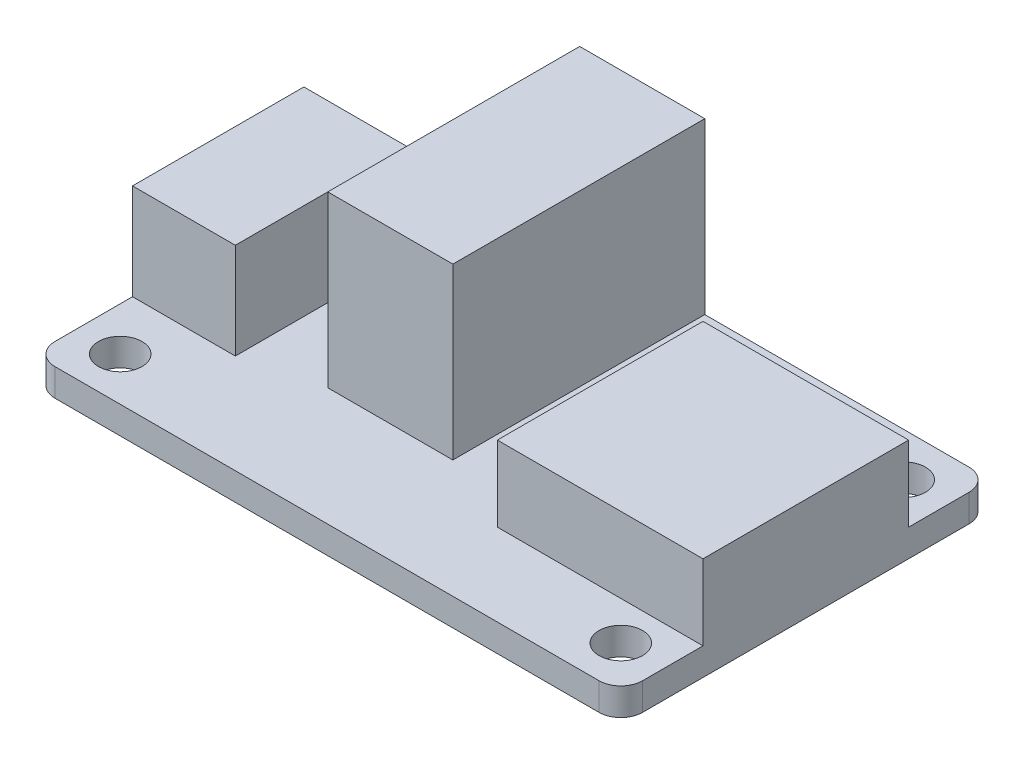
ISO-10303-21;
HEADER;
FILE_DESCRIPTION(('STEP AP214'),'2;1');
FILE_NAME('part.step','',(''),(''),'','','');
FILE_SCHEMA(('AUTOMOTIVE_DESIGN { 1 0 10303 214 1 1 1 1 }'));
ENDSEC;
DATA;
#1=APPLICATION_CONTEXT('core data for automotive mechanical design processes');
#2=APPLICATION_PROTOCOL_DEFINITION('international standard','automotive_design',2000,#1);
#3=PRODUCT_CONTEXT('',#1,'mechanical');
#4=PRODUCT('Part','Part','',(#3));
#5=PRODUCT_RELATED_PRODUCT_CATEGORY('part','',(#4));
#6=PRODUCT_DEFINITION_FORMATION('','',#4);
#7=PRODUCT_DEFINITION_CONTEXT('part definition',#1,'design');
#8=PRODUCT_DEFINITION('design','',#6,#7);
#9=PRODUCT_DEFINITION_SHAPE('','',#8);
#10=(LENGTH_UNIT() NAMED_UNIT(*) SI_UNIT(.MILLI.,.METRE.));
#11=(NAMED_UNIT(*) PLANE_ANGLE_UNIT() SI_UNIT($,.RADIAN.));
#12=(NAMED_UNIT(*) SI_UNIT($,.STERADIAN.) SOLID_ANGLE_UNIT());
#13=UNCERTAINTY_MEASURE_WITH_UNIT(LENGTH_MEASURE(1.E-05),#10,'distance_accuracy_value','');
#14=(GEOMETRIC_REPRESENTATION_CONTEXT(3) GLOBAL_UNCERTAINTY_ASSIGNED_CONTEXT((#13)) GLOBAL_UNIT_ASSIGNED_CONTEXT((#10,
#11,#12)) REPRESENTATION_CONTEXT('',''));
#15=CARTESIAN_POINT('',(0.,0.,0.));
#16=DIRECTION('',(0.,0.,1.));
#17=DIRECTION('',(1.,0.,0.));
#18=AXIS2_PLACEMENT_3D('',#15,#16,#17);
#19=CARTESIAN_POINT('',(0.,1.6,0.));
#20=DIRECTION('',(0.,-1.,0.));
#21=DIRECTION('',(0.,0.,-1.));
#22=AXIS2_PLACEMENT_3D('',#19,#20,#21);
#23=PLANE('',#22);
#24=CARTESIAN_POINT('',(-14.605,1.6,8.255));
#25=DIRECTION('',(0.,1.,0.));
#26=DIRECTION('',(0.,0.,-1.));
#27=AXIS2_PLACEMENT_3D('',#24,#25,#26);
#28=CIRCLE('',#27,1.27);
#29=CARTESIAN_POINT('',(-14.605,1.6,6.985));
#30=VERTEX_POINT('',#29);
#31=EDGE_CURVE('E256',#30,#30,#28,.T.);
#32=ORIENTED_EDGE('',*,*,#31,.F.);
#33=EDGE_LOOP('',(#32));
#34=FACE_BOUND('',#33,.T.);
#35=CARTESIAN_POINT('',(14.605,1.6,8.255));
#36=DIRECTION('',(0.,1.,0.));
#37=DIRECTION('',(0.,0.,1.));
#38=AXIS2_PLACEMENT_3D('',#35,#36,#37);
#39=CIRCLE('',#38,1.27);
#40=CARTESIAN_POINT('',(14.605,1.6,9.52500000000001));
#41=VERTEX_POINT('',#40);
#42=EDGE_CURVE('E262',#41,#41,#39,.T.);
#43=ORIENTED_EDGE('',*,*,#42,.F.);
#44=EDGE_LOOP('',(#43));
#45=FACE_BOUND('',#44,.T.);
#46=CARTESIAN_POINT('',(14.605,1.6,-8.255));
#47=DIRECTION('',(0.,1.,0.));
#48=DIRECTION('',(0.,0.,-1.));
#49=AXIS2_PLACEMENT_3D('',#46,#47,#48);
#50=CIRCLE('',#49,1.27);
#51=CARTESIAN_POINT('',(14.605,1.6,-9.52500000000001));
#52=VERTEX_POINT('',#51);
#53=EDGE_CURVE('E268',#52,#52,#50,.T.);
#54=ORIENTED_EDGE('',*,*,#53,.F.);
#55=EDGE_LOOP('',(#54));
#56=FACE_BOUND('',#55,.T.);
#57=CARTESIAN_POINT('',(-14.605,1.6,-8.255));
#58=DIRECTION('',(0.,1.,0.));
#59=DIRECTION('',(0.,0.,1.));
#60=AXIS2_PLACEMENT_3D('',#57,#58,#59);
#61=CIRCLE('',#60,1.27);
#62=CARTESIAN_POINT('',(-14.605,1.6,-6.985));
#63=VERTEX_POINT('',#62);
#64=EDGE_CURVE('E274',#63,#63,#61,.T.);
#65=ORIENTED_EDGE('',*,*,#64,.F.);
#66=EDGE_LOOP('',(#65));
#67=FACE_BOUND('',#66,.T.);
#68=DIRECTION('',(0.,0.,1.));
#69=VECTOR('',#68,1.);
#70=CARTESIAN_POINT('',(-6.845,1.6,0.));
#71=LINE('',#70,#69);
#72=CARTESIAN_POINT('',(-6.845,1.6,-10.795));
#73=VERTEX_POINT('',#72);
#74=CARTESIAN_POINT('',(-6.845,1.6,3.905));
#75=VERTEX_POINT('',#74);
#76=EDGE_CURVE('E190',#73,#75,#71,.T.);
#77=ORIENTED_EDGE('',*,*,#76,.F.);
#78=DIRECTION('',(-1.,0.,0.));
#79=VECTOR('',#78,1.);
#80=CARTESIAN_POINT('',(-17.145,1.6,-10.795));
#81=LINE('',#80,#79);
#82=CARTESIAN_POINT('',(-15.875,1.6,-10.795));
#83=VERTEX_POINT('',#82);
#84=EDGE_CURVE('E282',#73,#83,#81,.T.);
#85=ORIENTED_EDGE('',*,*,#84,.T.);
#86=CARTESIAN_POINT('',(-15.875,1.6,-9.525));
#87=DIRECTION('',(0.,-1.,0.));
#88=DIRECTION('',(0.,0.,-1.));
#89=AXIS2_PLACEMENT_3D('',#86,#87,#88);
#90=CIRCLE('',#89,1.27);
#91=CARTESIAN_POINT('',(-17.145,1.6,-9.525));
#92=VERTEX_POINT('',#91);
#93=EDGE_CURVE('E329',#83,#92,#90,.F.);
#94=ORIENTED_EDGE('',*,*,#93,.T.);
#95=DIRECTION('',(0.,0.,1.));
#96=VECTOR('',#95,1.);
#97=CARTESIAN_POINT('',(-17.145,1.6,10.795));
#98=LINE('',#97,#96);
#99=CARTESIAN_POINT('',(-17.145,1.6,-5.));
#100=VERTEX_POINT('',#99);
#101=EDGE_CURVE('E287',#92,#100,#98,.T.);
#102=ORIENTED_EDGE('',*,*,#101,.T.);
#103=DIRECTION('',(1.,0.,0.));
#104=VECTOR('',#103,1.);
#105=CARTESIAN_POINT('',(0.,1.6,-5.));
#106=LINE('',#105,#104);
#107=CARTESIAN_POINT('',(-11.145,1.6,-5.));
#108=VERTEX_POINT('',#107);
#109=EDGE_CURVE('E230',#100,#108,#106,.T.);
#110=ORIENTED_EDGE('',*,*,#109,.T.);
#111=DIRECTION('',(0.,0.,1.));
#112=VECTOR('',#111,1.);
#113=CARTESIAN_POINT('',(-11.145,1.6,0.));
#114=LINE('',#113,#112);
#115=CARTESIAN_POINT('',(-11.145,1.6,5.));
#116=VERTEX_POINT('',#115);
#117=EDGE_CURVE('E241',#108,#116,#114,.T.);
#118=ORIENTED_EDGE('',*,*,#117,.T.);
#119=DIRECTION('',(1.,0.,0.));
#120=VECTOR('',#119,1.);
#121=CARTESIAN_POINT('',(0.,1.6,5.));
#122=LINE('',#121,#120);
#123=CARTESIAN_POINT('',(-17.145,1.6,5.));
#124=VERTEX_POINT('',#123);
#125=EDGE_CURVE('E225',#124,#116,#122,.T.);
#126=ORIENTED_EDGE('',*,*,#125,.F.);
#127=CARTESIAN_POINT('',(-17.145,1.6,9.525));
#128=VERTEX_POINT('',#127);
#129=EDGE_CURVE('E286',#124,#128,#98,.T.);
#130=ORIENTED_EDGE('',*,*,#129,.T.);
#131=CARTESIAN_POINT('',(-15.875,1.6,9.525));
#132=DIRECTION('',(0.,-1.,0.));
#133=DIRECTION('',(0.,0.,-1.));
#134=AXIS2_PLACEMENT_3D('',#131,#132,#133);
#135=CIRCLE('',#134,1.27);
#136=CARTESIAN_POINT('',(-15.875,1.6,10.795));
#137=VERTEX_POINT('',#136);
#138=EDGE_CURVE('E323',#128,#137,#135,.F.);
#139=ORIENTED_EDGE('',*,*,#138,.T.);
#140=DIRECTION('',(1.,0.,0.));
#141=VECTOR('',#140,1.);
#142=CARTESIAN_POINT('',(-17.145,1.6,10.795));
#143=LINE('',#142,#141);
#144=CARTESIAN_POINT('',(15.875,1.6,10.795));
#145=VERTEX_POINT('',#144);
#146=EDGE_CURVE('E289',#137,#145,#143,.T.);
#147=ORIENTED_EDGE('',*,*,#146,.T.);
#148=CARTESIAN_POINT('',(15.875,1.6,9.525));
#149=DIRECTION('',(0.,-1.,0.));
#150=DIRECTION('',(0.,0.,-1.));
#151=AXIS2_PLACEMENT_3D('',#148,#149,#150);
#152=CIRCLE('',#151,1.27);
#153=CARTESIAN_POINT('',(17.145,1.6,9.525));
#154=VERTEX_POINT('',#153);
#155=EDGE_CURVE('E325',#145,#154,#152,.F.);
#156=ORIENTED_EDGE('',*,*,#155,.T.);
#157=DIRECTION('',(0.,0.,-1.));
#158=VECTOR('',#157,1.);
#159=CARTESIAN_POINT('',(17.145,1.6,10.795));
#160=LINE('',#159,#158);
#161=CARTESIAN_POINT('',(17.145,1.6,6.));
#162=VERTEX_POINT('',#161);
#163=EDGE_CURVE('E280',#154,#162,#160,.T.);
#164=ORIENTED_EDGE('',*,*,#163,.T.);
#165=DIRECTION('',(-1.,0.,0.));
#166=VECTOR('',#165,1.);
#167=CARTESIAN_POINT('',(0.,1.6,6.));
#168=LINE('',#167,#166);
#169=CARTESIAN_POINT('',(5.145,1.6,6.));
#170=VERTEX_POINT('',#169);
#171=EDGE_CURVE('E194',#162,#170,#168,.T.);
#172=ORIENTED_EDGE('',*,*,#171,.T.);
#173=DIRECTION('',(0.,0.,1.));
#174=VECTOR('',#173,1.);
#175=CARTESIAN_POINT('',(5.145,1.6,0.));
#176=LINE('',#175,#174);
#177=CARTESIAN_POINT('',(5.145,1.6,-6.));
#178=VERTEX_POINT('',#177);
#179=EDGE_CURVE('E191',#178,#170,#176,.T.);
#180=ORIENTED_EDGE('',*,*,#179,.F.);
#181=DIRECTION('',(-1.,0.,0.));
#182=VECTOR('',#181,1.);
#183=CARTESIAN_POINT('',(0.,1.6,-6.));
#184=LINE('',#183,#182);
#185=CARTESIAN_POINT('',(17.145,1.6,-6.));
#186=VERTEX_POINT('',#185);
#187=EDGE_CURVE('E203',#186,#178,#184,.T.);
#188=ORIENTED_EDGE('',*,*,#187,.F.);
#189=CARTESIAN_POINT('',(17.145,1.6,-9.525));
#190=VERTEX_POINT('',#189);
#191=EDGE_CURVE('E283',#186,#190,#160,.T.);
#192=ORIENTED_EDGE('',*,*,#191,.T.);
#193=CARTESIAN_POINT('',(15.875,1.6,-9.525));
#194=DIRECTION('',(0.,-1.,0.));
#195=DIRECTION('',(0.,0.,-1.));
#196=AXIS2_PLACEMENT_3D('',#193,#194,#195);
#197=CIRCLE('',#196,1.27);
#198=CARTESIAN_POINT('',(15.875,1.6,-10.795));
#199=VERTEX_POINT('',#198);
#200=EDGE_CURVE('E327',#190,#199,#197,.F.);
#201=ORIENTED_EDGE('',*,*,#200,.T.);
#202=CARTESIAN_POINT('',(0.455000000000001,1.6,-10.795));
#203=VERTEX_POINT('',#202);
#204=EDGE_CURVE('E284',#199,#203,#81,.T.);
#205=ORIENTED_EDGE('',*,*,#204,.T.);
#206=DIRECTION('',(0.,0.,1.));
#207=VECTOR('',#206,1.);
#208=CARTESIAN_POINT('',(0.455000000000002,1.6,0.));
#209=LINE('',#208,#207);
#210=CARTESIAN_POINT('',(0.455000000000002,1.6,3.905));
#211=VERTEX_POINT('',#210);
#212=EDGE_CURVE('E53',#203,#211,#209,.T.);
#213=ORIENTED_EDGE('',*,*,#212,.T.);
#214=DIRECTION('',(1.,0.,0.));
#215=VECTOR('',#214,1.);
#216=CARTESIAN_POINT('',(0.,1.6,3.905));
#217=LINE('',#216,#215);
#218=EDGE_CURVE('E48',#75,#211,#217,.T.);
#219=ORIENTED_EDGE('',*,*,#218,.F.);
#220=EDGE_LOOP('',(#77,#85,#94,#102,#110,#118,#126,#130,#139,#147,#156,#164,#172,#180,#188,#192,
#201,#205,#213,#219));
#221=FACE_BOUND('',#220,.T.);
#222=ADVANCED_FACE('F33',(#34,#45,#56,#67,#221),#23,.F.);
#223=CARTESIAN_POINT('',(0.,0.,0.));
#224=DIRECTION('',(0.,-1.,0.));
#225=DIRECTION('',(0.,0.,-1.));
#226=AXIS2_PLACEMENT_3D('',#223,#224,#225);
#227=PLANE('',#226);
#228=CARTESIAN_POINT('',(14.605,0.,8.255));
#229=DIRECTION('',(0.,1.,0.));
#230=DIRECTION('',(0.,0.,1.));
#231=AXIS2_PLACEMENT_3D('',#228,#229,#230);
#232=CIRCLE('',#231,1.27);
#233=CARTESIAN_POINT('',(14.605,0.,9.52500000000001));
#234=VERTEX_POINT('',#233);
#235=EDGE_CURVE('E259',#234,#234,#232,.T.);
#236=ORIENTED_EDGE('',*,*,#235,.T.);
#237=EDGE_LOOP('',(#236));
#238=FACE_BOUND('',#237,.T.);
#239=CARTESIAN_POINT('',(-14.605,0.,-8.255));
#240=DIRECTION('',(0.,1.,0.));
#241=DIRECTION('',(0.,0.,1.));
#242=AXIS2_PLACEMENT_3D('',#239,#240,#241);
#243=CIRCLE('',#242,1.27);
#244=CARTESIAN_POINT('',(-14.605,0.,-6.985));
#245=VERTEX_POINT('',#244);
#246=EDGE_CURVE('E271',#245,#245,#243,.T.);
#247=ORIENTED_EDGE('',*,*,#246,.T.);
#248=EDGE_LOOP('',(#247));
#249=FACE_BOUND('',#248,.T.);
#250=DIRECTION('',(0.,0.,1.));
#251=VECTOR('',#250,1.);
#252=CARTESIAN_POINT('',(-17.145,0.,10.795));
#253=LINE('',#252,#251);
#254=CARTESIAN_POINT('',(-17.145,0.,-9.525));
#255=VERTEX_POINT('',#254);
#256=CARTESIAN_POINT('',(-17.145,0.,9.525));
#257=VERTEX_POINT('',#256);
#258=EDGE_CURVE('E298',#255,#257,#253,.T.);
#259=ORIENTED_EDGE('',*,*,#258,.F.);
#260=CARTESIAN_POINT('',(-15.875,0.,-9.525));
#261=DIRECTION('',(0.,-1.,0.));
#262=DIRECTION('',(0.,0.,-1.));
#263=AXIS2_PLACEMENT_3D('',#260,#261,#262);
#264=CIRCLE('',#263,1.27);
#265=CARTESIAN_POINT('',(-15.875,0.,-10.795));
#266=VERTEX_POINT('',#265);
#267=EDGE_CURVE('E315',#255,#266,#264,.T.);
#268=ORIENTED_EDGE('',*,*,#267,.T.);
#269=DIRECTION('',(-1.,0.,0.));
#270=VECTOR('',#269,1.);
#271=CARTESIAN_POINT('',(-17.145,0.,-10.795));
#272=LINE('',#271,#270);
#273=CARTESIAN_POINT('',(15.875,0.,-10.795));
#274=VERTEX_POINT('',#273);
#275=EDGE_CURVE('E295',#274,#266,#272,.T.);
#276=ORIENTED_EDGE('',*,*,#275,.F.);
#277=CARTESIAN_POINT('',(15.875,0.,-9.525));
#278=DIRECTION('',(0.,-1.,0.));
#279=DIRECTION('',(0.,0.,-1.));
#280=AXIS2_PLACEMENT_3D('',#277,#278,#279);
#281=CIRCLE('',#280,1.27);
#282=CARTESIAN_POINT('',(17.145,0.,-9.525));
#283=VERTEX_POINT('',#282);
#284=EDGE_CURVE('E313',#274,#283,#281,.T.);
#285=ORIENTED_EDGE('',*,*,#284,.T.);
#286=DIRECTION('',(0.,0.,-1.));
#287=VECTOR('',#286,1.);
#288=CARTESIAN_POINT('',(17.145,0.,10.795));
#289=LINE('',#288,#287);
#290=CARTESIAN_POINT('',(17.145,0.,9.525));
#291=VERTEX_POINT('',#290);
#292=EDGE_CURVE('E277',#291,#283,#289,.T.);
#293=ORIENTED_EDGE('',*,*,#292,.F.);
#294=CARTESIAN_POINT('',(15.875,0.,9.525));
#295=DIRECTION('',(0.,-1.,0.));
#296=DIRECTION('',(0.,0.,-1.));
#297=AXIS2_PLACEMENT_3D('',#294,#295,#296);
#298=CIRCLE('',#297,1.27);
#299=CARTESIAN_POINT('',(15.875,0.,10.795));
#300=VERTEX_POINT('',#299);
#301=EDGE_CURVE('E311',#291,#300,#298,.T.);
#302=ORIENTED_EDGE('',*,*,#301,.T.);
#303=DIRECTION('',(1.,0.,0.));
#304=VECTOR('',#303,1.);
#305=CARTESIAN_POINT('',(-17.145,0.,10.795));
#306=LINE('',#305,#304);
#307=CARTESIAN_POINT('',(-15.875,0.,10.795));
#308=VERTEX_POINT('',#307);
#309=EDGE_CURVE('E301',#308,#300,#306,.T.);
#310=ORIENTED_EDGE('',*,*,#309,.F.);
#311=CARTESIAN_POINT('',(-15.875,0.,9.525));
#312=DIRECTION('',(0.,-1.,0.));
#313=DIRECTION('',(0.,0.,-1.));
#314=AXIS2_PLACEMENT_3D('',#311,#312,#313);
#315=CIRCLE('',#314,1.27);
#316=EDGE_CURVE('E309',#308,#257,#315,.T.);
#317=ORIENTED_EDGE('',*,*,#316,.T.);
#318=EDGE_LOOP('',(#259,#268,#276,#285,#293,#302,#310,#317));
#319=FACE_BOUND('',#318,.T.);
#320=CARTESIAN_POINT('',(14.605,0.,-8.255));
#321=DIRECTION('',(0.,1.,0.));
#322=DIRECTION('',(0.,0.,-1.));
#323=AXIS2_PLACEMENT_3D('',#320,#321,#322);
#324=CIRCLE('',#323,1.27);
#325=CARTESIAN_POINT('',(14.605,0.,-9.52500000000001));
#326=VERTEX_POINT('',#325);
#327=EDGE_CURVE('E265',#326,#326,#324,.T.);
#328=ORIENTED_EDGE('',*,*,#327,.T.);
#329=EDGE_LOOP('',(#328));
#330=FACE_BOUND('',#329,.T.);
#331=CARTESIAN_POINT('',(-14.605,0.,8.255));
#332=DIRECTION('',(0.,1.,0.));
#333=DIRECTION('',(0.,0.,-1.));
#334=AXIS2_PLACEMENT_3D('',#331,#332,#333);
#335=CIRCLE('',#334,1.27);
#336=CARTESIAN_POINT('',(-14.605,0.,6.985));
#337=VERTEX_POINT('',#336);
#338=EDGE_CURVE('E255',#337,#337,#335,.T.);
#339=ORIENTED_EDGE('',*,*,#338,.T.);
#340=EDGE_LOOP('',(#339));
#341=FACE_BOUND('',#340,.T.);
#342=ADVANCED_FACE('F347',(#238,#249,#319,#330,#341),#227,.T.);
#343=CARTESIAN_POINT('',(17.145,1.6,10.795));
#344=DIRECTION('',(-1.,0.,0.));
#345=DIRECTION('',(0.,0.,1.));
#346=AXIS2_PLACEMENT_3D('',#343,#344,#345);
#347=PLANE('',#346);
#348=ORIENTED_EDGE('',*,*,#292,.T.);
#349=DIRECTION('',(0.,-1.,0.));
#350=VECTOR('',#349,1.);
#351=CARTESIAN_POINT('',(17.145,1.6,-9.525));
#352=LINE('',#351,#350);
#353=EDGE_CURVE('E334',#283,#190,#352,.F.);
#354=ORIENTED_EDGE('',*,*,#353,.T.);
#355=ORIENTED_EDGE('',*,*,#191,.F.);
#356=DIRECTION('',(0.,-1.,0.));
#357=VECTOR('',#356,1.);
#358=CARTESIAN_POINT('',(17.145,6.,-6.));
#359=LINE('',#358,#357);
#360=CARTESIAN_POINT('',(17.145,6.,-6.));
#361=VERTEX_POINT('',#360);
#362=EDGE_CURVE('E216',#361,#186,#359,.T.);
#363=ORIENTED_EDGE('',*,*,#362,.F.);
#364=DIRECTION('',(0.,0.,-1.));
#365=VECTOR('',#364,1.);
#366=CARTESIAN_POINT('',(17.145,6.,0.));
#367=LINE('',#366,#365);
#368=CARTESIAN_POINT('',(17.145,6.,6.));
#369=VERTEX_POINT('',#368);
#370=EDGE_CURVE('E206',#369,#361,#367,.T.);
#371=ORIENTED_EDGE('',*,*,#370,.F.);
#372=DIRECTION('',(0.,-1.,0.));
#373=VECTOR('',#372,1.);
#374=CARTESIAN_POINT('',(17.145,6.,6.));
#375=LINE('',#374,#373);
#376=EDGE_CURVE('E219',#369,#162,#375,.T.);
#377=ORIENTED_EDGE('',*,*,#376,.T.);
#378=ORIENTED_EDGE('',*,*,#163,.F.);
#379=DIRECTION('',(0.,-1.,0.));
#380=VECTOR('',#379,1.);
#381=CARTESIAN_POINT('',(17.145,1.6,9.525));
#382=LINE('',#381,#380);
#383=EDGE_CURVE('E331',#154,#291,#382,.T.);
#384=ORIENTED_EDGE('',*,*,#383,.T.);
#385=EDGE_LOOP('',(#348,#354,#355,#363,#371,#377,#378,#384));
#386=FACE_BOUND('',#385,.T.);
#387=ADVANCED_FACE('F356',(#386),#347,.F.);
#388=CARTESIAN_POINT('',(-17.145,1.6,-10.795));
#389=DIRECTION('',(0.,0.,1.));
#390=DIRECTION('',(1.,0.,0.));
#391=AXIS2_PLACEMENT_3D('',#388,#389,#390);
#392=PLANE('',#391);
#393=ORIENTED_EDGE('',*,*,#275,.T.);
#394=DIRECTION('',(0.,-1.,0.));
#395=VECTOR('',#394,1.);
#396=CARTESIAN_POINT('',(-15.875,1.6,-10.795));
#397=LINE('',#396,#395);
#398=EDGE_CURVE('E320',#266,#83,#397,.F.);
#399=ORIENTED_EDGE('',*,*,#398,.T.);
#400=ORIENTED_EDGE('',*,*,#84,.F.);
#401=DIRECTION('',(0.,-1.,0.));
#402=VECTOR('',#401,1.);
#403=CARTESIAN_POINT('',(-6.845,11.5,-10.795));
#404=LINE('',#403,#402);
#405=CARTESIAN_POINT('',(-6.845,11.5,-10.795));
#406=VERTEX_POINT('',#405);
#407=EDGE_CURVE('E645',#406,#73,#404,.T.);
#408=ORIENTED_EDGE('',*,*,#407,.F.);
#409=DIRECTION('',(-1.,0.,0.));
#410=VECTOR('',#409,1.);
#411=CARTESIAN_POINT('',(0.,11.5,-10.795));
#412=LINE('',#411,#410);
#413=CARTESIAN_POINT('',(0.455000000000001,11.5,-10.795));
#414=VERTEX_POINT('',#413);
#415=EDGE_CURVE('E184',#414,#406,#412,.T.);
#416=ORIENTED_EDGE('',*,*,#415,.F.);
#417=DIRECTION('',(0.,-1.,0.));
#418=VECTOR('',#417,1.);
#419=CARTESIAN_POINT('',(0.455000000000001,11.5,-10.795));
#420=LINE('',#419,#418);
#421=EDGE_CURVE('E196',#414,#203,#420,.T.);
#422=ORIENTED_EDGE('',*,*,#421,.T.);
#423=ORIENTED_EDGE('',*,*,#204,.F.);
#424=DIRECTION('',(0.,-1.,0.));
#425=VECTOR('',#424,1.);
#426=CARTESIAN_POINT('',(15.875,1.6,-10.795));
#427=LINE('',#426,#425);
#428=EDGE_CURVE('E317',#199,#274,#427,.T.);
#429=ORIENTED_EDGE('',*,*,#428,.T.);
#430=EDGE_LOOP('',(#393,#399,#400,#408,#416,#422,#423,#429));
#431=FACE_BOUND('',#430,.T.);
#432=ADVANCED_FACE('F371',(#431),#392,.F.);
#433=CARTESIAN_POINT('',(-17.145,1.6,10.795));
#434=DIRECTION('',(1.,0.,0.));
#435=DIRECTION('',(0.,0.,-1.));
#436=AXIS2_PLACEMENT_3D('',#433,#434,#435);
#437=PLANE('',#436);
#438=ORIENTED_EDGE('',*,*,#101,.F.);
#439=DIRECTION('',(0.,-1.,0.));
#440=VECTOR('',#439,1.);
#441=CARTESIAN_POINT('',(-17.145,1.6,-9.525));
#442=LINE('',#441,#440);
#443=EDGE_CURVE('E306',#92,#255,#442,.T.);
#444=ORIENTED_EDGE('',*,*,#443,.T.);
#445=ORIENTED_EDGE('',*,*,#258,.T.);
#446=DIRECTION('',(0.,-1.,0.));
#447=VECTOR('',#446,1.);
#448=CARTESIAN_POINT('',(-17.145,1.6,9.525));
#449=LINE('',#448,#447);
#450=EDGE_CURVE('E292',#257,#128,#449,.F.);
#451=ORIENTED_EDGE('',*,*,#450,.T.);
#452=ORIENTED_EDGE('',*,*,#129,.F.);
#453=DIRECTION('',(0.,-1.,0.));
#454=VECTOR('',#453,1.);
#455=CARTESIAN_POINT('',(-17.145,7.2,5.));
#456=LINE('',#455,#454);
#457=CARTESIAN_POINT('',(-17.145,7.2,5.));
#458=VERTEX_POINT('',#457);
#459=EDGE_CURVE('E252',#458,#124,#456,.T.);
#460=ORIENTED_EDGE('',*,*,#459,.F.);
#461=DIRECTION('',(0.,0.,1.));
#462=VECTOR('',#461,1.);
#463=CARTESIAN_POINT('',(-17.145,7.2,0.));
#464=LINE('',#463,#462);
#465=CARTESIAN_POINT('',(-17.145,7.2,-5.));
#466=VERTEX_POINT('',#465);
#467=EDGE_CURVE('E226',#466,#458,#464,.T.);
#468=ORIENTED_EDGE('',*,*,#467,.F.);
#469=DIRECTION('',(0.,-1.,0.));
#470=VECTOR('',#469,1.);
#471=CARTESIAN_POINT('',(-17.145,7.2,-5.));
#472=LINE('',#471,#470);
#473=EDGE_CURVE('E238',#466,#100,#472,.T.);
#474=ORIENTED_EDGE('',*,*,#473,.T.);
#475=EDGE_LOOP('',(#438,#444,#445,#451,#452,#460,#468,#474));
#476=FACE_BOUND('',#475,.T.);
#477=ADVANCED_FACE('F364',(#476),#437,.F.);
#478=CARTESIAN_POINT('',(-17.145,1.6,10.795));
#479=DIRECTION('',(0.,0.,-1.));
#480=DIRECTION('',(-1.,0.,0.));
#481=AXIS2_PLACEMENT_3D('',#478,#479,#480);
#482=PLANE('',#481);
#483=ORIENTED_EDGE('',*,*,#309,.T.);
#484=DIRECTION('',(0.,-1.,0.));
#485=VECTOR('',#484,1.);
#486=CARTESIAN_POINT('',(15.875,1.6,10.795));
#487=LINE('',#486,#485);
#488=EDGE_CURVE('E11',#300,#145,#487,.F.);
#489=ORIENTED_EDGE('',*,*,#488,.T.);
#490=ORIENTED_EDGE('',*,*,#146,.F.);
#491=DIRECTION('',(0.,-1.,0.));
#492=VECTOR('',#491,1.);
#493=CARTESIAN_POINT('',(-15.875,1.6,10.795));
#494=LINE('',#493,#492);
#495=EDGE_CURVE('E41',#137,#308,#494,.T.);
#496=ORIENTED_EDGE('',*,*,#495,.T.);
#497=EDGE_LOOP('',(#483,#489,#490,#496));
#498=FACE_BOUND('',#497,.T.);
#499=ADVANCED_FACE('F341',(#498),#482,.F.);
#500=CARTESIAN_POINT('',(-14.605,1.6,-8.255));
#501=DIRECTION('',(0.,-1.,0.));
#502=DIRECTION('',(0.,0.,-1.));
#503=AXIS2_PLACEMENT_3D('',#500,#501,#502);
#504=CYLINDRICAL_SURFACE('',#503,1.27);
#505=ORIENTED_EDGE('',*,*,#64,.T.);
#506=EDGE_LOOP('',(#505));
#507=FACE_BOUND('',#506,.T.);
#508=ORIENTED_EDGE('',*,*,#246,.F.);
#509=EDGE_LOOP('',(#508));
#510=FACE_BOUND('',#509,.T.);
#511=ADVANCED_FACE('F412',(#507,#510),#504,.F.);
#512=CARTESIAN_POINT('',(14.605,1.6,-8.255));
#513=DIRECTION('',(0.,-1.,0.));
#514=DIRECTION('',(0.,0.,-1.));
#515=AXIS2_PLACEMENT_3D('',#512,#513,#514);
#516=CYLINDRICAL_SURFACE('',#515,1.27);
#517=ORIENTED_EDGE('',*,*,#53,.T.);
#518=EDGE_LOOP('',(#517));
#519=FACE_BOUND('',#518,.T.);
#520=ORIENTED_EDGE('',*,*,#327,.F.);
#521=EDGE_LOOP('',(#520));
#522=FACE_BOUND('',#521,.T.);
#523=ADVANCED_FACE('F447',(#519,#522),#516,.F.);
#524=CARTESIAN_POINT('',(14.605,1.6,8.255));
#525=DIRECTION('',(0.,-1.,0.));
#526=DIRECTION('',(0.,0.,-1.));
#527=AXIS2_PLACEMENT_3D('',#524,#525,#526);
#528=CYLINDRICAL_SURFACE('',#527,1.27);
#529=ORIENTED_EDGE('',*,*,#42,.T.);
#530=EDGE_LOOP('',(#529));
#531=FACE_BOUND('',#530,.T.);
#532=ORIENTED_EDGE('',*,*,#235,.F.);
#533=EDGE_LOOP('',(#532));
#534=FACE_BOUND('',#533,.T.);
#535=ADVANCED_FACE('F444',(#531,#534),#528,.F.);
#536=CARTESIAN_POINT('',(-14.605,1.6,8.255));
#537=DIRECTION('',(0.,-1.,0.));
#538=DIRECTION('',(0.,0.,-1.));
#539=AXIS2_PLACEMENT_3D('',#536,#537,#538);
#540=CYLINDRICAL_SURFACE('',#539,1.27);
#541=ORIENTED_EDGE('',*,*,#31,.T.);
#542=EDGE_LOOP('',(#541));
#543=FACE_BOUND('',#542,.T.);
#544=ORIENTED_EDGE('',*,*,#338,.F.);
#545=EDGE_LOOP('',(#544));
#546=FACE_BOUND('',#545,.T.);
#547=ADVANCED_FACE('F426',(#543,#546),#540,.F.);
#548=CARTESIAN_POINT('',(-15.875,1.6,-9.525));
#549=DIRECTION('',(0.,-1.,0.));
#550=DIRECTION('',(0.,0.,-1.));
#551=AXIS2_PLACEMENT_3D('',#548,#549,#550);
#552=CYLINDRICAL_SURFACE('',#551,1.27);
#553=ORIENTED_EDGE('',*,*,#93,.F.);
#554=ORIENTED_EDGE('',*,*,#398,.F.);
#555=ORIENTED_EDGE('',*,*,#267,.F.);
#556=ORIENTED_EDGE('',*,*,#443,.F.);
#557=EDGE_LOOP('',(#553,#554,#555,#556));
#558=FACE_BOUND('',#557,.T.);
#559=ADVANCED_FACE('F375',(#558),#552,.T.);
#560=CARTESIAN_POINT('',(15.875,1.6,-9.525));
#561=DIRECTION('',(0.,-1.,0.));
#562=DIRECTION('',(0.,0.,-1.));
#563=AXIS2_PLACEMENT_3D('',#560,#561,#562);
#564=CYLINDRICAL_SURFACE('',#563,1.27);
#565=ORIENTED_EDGE('',*,*,#200,.F.);
#566=ORIENTED_EDGE('',*,*,#353,.F.);
#567=ORIENTED_EDGE('',*,*,#284,.F.);
#568=ORIENTED_EDGE('',*,*,#428,.F.);
#569=EDGE_LOOP('',(#565,#566,#567,#568));
#570=FACE_BOUND('',#569,.T.);
#571=ADVANCED_FACE('F425',(#570),#564,.T.);
#572=CARTESIAN_POINT('',(15.875,1.6,9.525));
#573=DIRECTION('',(0.,-1.,0.));
#574=DIRECTION('',(0.,0.,-1.));
#575=AXIS2_PLACEMENT_3D('',#572,#573,#574);
#576=CYLINDRICAL_SURFACE('',#575,1.27);
#577=ORIENTED_EDGE('',*,*,#155,.F.);
#578=ORIENTED_EDGE('',*,*,#488,.F.);
#579=ORIENTED_EDGE('',*,*,#301,.F.);
#580=ORIENTED_EDGE('',*,*,#383,.F.);
#581=EDGE_LOOP('',(#577,#578,#579,#580));
#582=FACE_BOUND('',#581,.T.);
#583=ADVANCED_FACE('F353',(#582),#576,.T.);
#584=CARTESIAN_POINT('',(-15.875,1.6,9.525));
#585=DIRECTION('',(0.,-1.,0.));
#586=DIRECTION('',(0.,0.,-1.));
#587=AXIS2_PLACEMENT_3D('',#584,#585,#586);
#588=CYLINDRICAL_SURFACE('',#587,1.27);
#589=ORIENTED_EDGE('',*,*,#138,.F.);
#590=ORIENTED_EDGE('',*,*,#450,.F.);
#591=ORIENTED_EDGE('',*,*,#316,.F.);
#592=ORIENTED_EDGE('',*,*,#495,.F.);
#593=EDGE_LOOP('',(#589,#590,#591,#592));
#594=FACE_BOUND('',#593,.T.);
#595=ADVANCED_FACE('F35',(#594),#588,.T.);
#596=CARTESIAN_POINT('',(0.,7.2,5.));
#597=DIRECTION('',(0.,0.,-1.));
#598=DIRECTION('',(-1.,0.,0.));
#599=AXIS2_PLACEMENT_3D('',#596,#597,#598);
#600=PLANE('',#599);
#601=ORIENTED_EDGE('',*,*,#125,.T.);
#602=DIRECTION('',(0.,-1.,0.));
#603=VECTOR('',#602,1.);
#604=CARTESIAN_POINT('',(-11.145,7.2,5.));
#605=LINE('',#604,#603);
#606=CARTESIAN_POINT('',(-11.145,7.2,5.));
#607=VERTEX_POINT('',#606);
#608=EDGE_CURVE('E249',#607,#116,#605,.T.);
#609=ORIENTED_EDGE('',*,*,#608,.F.);
#610=DIRECTION('',(1.,0.,0.));
#611=VECTOR('',#610,1.);
#612=CARTESIAN_POINT('',(0.,7.2,5.));
#613=LINE('',#612,#611);
#614=EDGE_CURVE('E229',#458,#607,#613,.T.);
#615=ORIENTED_EDGE('',*,*,#614,.F.);
#616=ORIENTED_EDGE('',*,*,#459,.T.);
#617=EDGE_LOOP('',(#601,#609,#615,#616));
#618=FACE_BOUND('',#617,.T.);
#619=ADVANCED_FACE('F387',(#618),#600,.F.);
#620=CARTESIAN_POINT('',(-11.145,7.2,0.));
#621=DIRECTION('',(1.,0.,0.));
#622=DIRECTION('',(0.,0.,-1.));
#623=AXIS2_PLACEMENT_3D('',#620,#621,#622);
#624=PLANE('',#623);
#625=ORIENTED_EDGE('',*,*,#117,.F.);
#626=DIRECTION('',(0.,-1.,0.));
#627=VECTOR('',#626,1.);
#628=CARTESIAN_POINT('',(-11.145,7.2,-5.));
#629=LINE('',#628,#627);
#630=CARTESIAN_POINT('',(-11.145,7.2,-5.));
#631=VERTEX_POINT('',#630);
#632=EDGE_CURVE('E246',#631,#108,#629,.T.);
#633=ORIENTED_EDGE('',*,*,#632,.F.);
#634=DIRECTION('',(0.,0.,1.));
#635=VECTOR('',#634,1.);
#636=CARTESIAN_POINT('',(-11.145,7.2,0.));
#637=LINE('',#636,#635);
#638=EDGE_CURVE('E232',#631,#607,#637,.T.);
#639=ORIENTED_EDGE('',*,*,#638,.T.);
#640=ORIENTED_EDGE('',*,*,#608,.T.);
#641=EDGE_LOOP('',(#625,#633,#639,#640));
#642=FACE_BOUND('',#641,.T.);
#643=ADVANCED_FACE('F384',(#642),#624,.T.);
#644=CARTESIAN_POINT('',(0.,7.2,-5.));
#645=DIRECTION('',(0.,0.,-1.));
#646=DIRECTION('',(-1.,0.,0.));
#647=AXIS2_PLACEMENT_3D('',#644,#645,#646);
#648=PLANE('',#647);
#649=ORIENTED_EDGE('',*,*,#109,.F.);
#650=ORIENTED_EDGE('',*,*,#473,.F.);
#651=DIRECTION('',(1.,0.,0.));
#652=VECTOR('',#651,1.);
#653=CARTESIAN_POINT('',(0.,7.2,-5.));
#654=LINE('',#653,#652);
#655=EDGE_CURVE('E235',#466,#631,#654,.T.);
#656=ORIENTED_EDGE('',*,*,#655,.T.);
#657=ORIENTED_EDGE('',*,*,#632,.T.);
#658=EDGE_LOOP('',(#649,#650,#656,#657));
#659=FACE_BOUND('',#658,.T.);
#660=ADVANCED_FACE('F380',(#659),#648,.T.);
#661=CARTESIAN_POINT('',(0.,7.2,0.));
#662=DIRECTION('',(0.,1.,0.));
#663=DIRECTION('',(0.,0.,1.));
#664=AXIS2_PLACEMENT_3D('',#661,#662,#663);
#665=PLANE('',#664);
#666=ORIENTED_EDGE('',*,*,#467,.T.);
#667=ORIENTED_EDGE('',*,*,#614,.T.);
#668=ORIENTED_EDGE('',*,*,#638,.F.);
#669=ORIENTED_EDGE('',*,*,#655,.F.);
#670=EDGE_LOOP('',(#666,#667,#668,#669));
#671=FACE_BOUND('',#670,.T.);
#672=ADVANCED_FACE('F389',(#671),#665,.T.);
#673=CARTESIAN_POINT('',(5.145,6.,0.));
#674=DIRECTION('',(1.,0.,0.));
#675=DIRECTION('',(0.,0.,-1.));
#676=AXIS2_PLACEMENT_3D('',#673,#674,#675);
#677=PLANE('',#676);
#678=ORIENTED_EDGE('',*,*,#179,.T.);
#679=DIRECTION('',(0.,-1.,0.));
#680=VECTOR('',#679,1.);
#681=CARTESIAN_POINT('',(5.145,6.,6.));
#682=LINE('',#681,#680);
#683=CARTESIAN_POINT('',(5.145,6.,6.));
#684=VERTEX_POINT('',#683);
#685=EDGE_CURVE('E222',#684,#170,#682,.T.);
#686=ORIENTED_EDGE('',*,*,#685,.F.);
#687=DIRECTION('',(0.,0.,1.));
#688=VECTOR('',#687,1.);
#689=CARTESIAN_POINT('',(5.145,6.,0.));
#690=LINE('',#689,#688);
#691=CARTESIAN_POINT('',(5.145,6.,-6.));
#692=VERTEX_POINT('',#691);
#693=EDGE_CURVE('E200',#692,#684,#690,.T.);
#694=ORIENTED_EDGE('',*,*,#693,.F.);
#695=DIRECTION('',(0.,-1.,0.));
#696=VECTOR('',#695,1.);
#697=CARTESIAN_POINT('',(5.145,6.,-6.));
#698=LINE('',#697,#696);
#699=EDGE_CURVE('E209',#692,#178,#698,.T.);
#700=ORIENTED_EDGE('',*,*,#699,.T.);
#701=EDGE_LOOP('',(#678,#686,#694,#700));
#702=FACE_BOUND('',#701,.T.);
#703=ADVANCED_FACE('F391',(#702),#677,.F.);
#704=CARTESIAN_POINT('',(0.,6.,6.));
#705=DIRECTION('',(0.,0.,1.));
#706=DIRECTION('',(1.,0.,0.));
#707=AXIS2_PLACEMENT_3D('',#704,#705,#706);
#708=PLANE('',#707);
#709=ORIENTED_EDGE('',*,*,#171,.F.);
#710=ORIENTED_EDGE('',*,*,#376,.F.);
#711=DIRECTION('',(-1.,0.,0.));
#712=VECTOR('',#711,1.);
#713=CARTESIAN_POINT('',(0.,6.,6.));
#714=LINE('',#713,#712);
#715=EDGE_CURVE('E202',#369,#684,#714,.T.);
#716=ORIENTED_EDGE('',*,*,#715,.T.);
#717=ORIENTED_EDGE('',*,*,#685,.T.);
#718=EDGE_LOOP('',(#709,#710,#716,#717));
#719=FACE_BOUND('',#718,.T.);
#720=ADVANCED_FACE('F397',(#719),#708,.T.);
#721=CARTESIAN_POINT('',(0.,6.,-6.));
#722=DIRECTION('',(0.,0.,1.));
#723=DIRECTION('',(1.,0.,0.));
#724=AXIS2_PLACEMENT_3D('',#721,#722,#723);
#725=PLANE('',#724);
#726=ORIENTED_EDGE('',*,*,#187,.T.);
#727=ORIENTED_EDGE('',*,*,#699,.F.);
#728=DIRECTION('',(-1.,0.,0.));
#729=VECTOR('',#728,1.);
#730=CARTESIAN_POINT('',(0.,6.,-6.));
#731=LINE('',#730,#729);
#732=EDGE_CURVE('E208',#361,#692,#731,.T.);
#733=ORIENTED_EDGE('',*,*,#732,.F.);
#734=ORIENTED_EDGE('',*,*,#362,.T.);
#735=EDGE_LOOP('',(#726,#727,#733,#734));
#736=FACE_BOUND('',#735,.T.);
#737=ADVANCED_FACE('F574',(#736),#725,.F.);
#738=CARTESIAN_POINT('',(0.,6.,0.));
#739=DIRECTION('',(0.,1.,0.));
#740=DIRECTION('',(0.,0.,1.));
#741=AXIS2_PLACEMENT_3D('',#738,#739,#740);
#742=PLANE('',#741);
#743=ORIENTED_EDGE('',*,*,#693,.T.);
#744=ORIENTED_EDGE('',*,*,#715,.F.);
#745=ORIENTED_EDGE('',*,*,#370,.T.);
#746=ORIENTED_EDGE('',*,*,#732,.T.);
#747=EDGE_LOOP('',(#743,#744,#745,#746));
#748=FACE_BOUND('',#747,.T.);
#749=ADVANCED_FACE('F583',(#748),#742,.T.);
#750=CARTESIAN_POINT('',(-6.845,11.5,0.));
#751=DIRECTION('',(1.,0.,0.));
#752=DIRECTION('',(0.,0.,-1.));
#753=AXIS2_PLACEMENT_3D('',#750,#751,#752);
#754=PLANE('',#753);
#755=ORIENTED_EDGE('',*,*,#76,.T.);
#756=DIRECTION('',(0.,-1.,0.));
#757=VECTOR('',#756,1.);
#758=CARTESIAN_POINT('',(-6.845,11.5,3.905));
#759=LINE('',#758,#757);
#760=CARTESIAN_POINT('',(-6.845,11.5,3.905));
#761=VERTEX_POINT('',#760);
#762=EDGE_CURVE('E172',#761,#75,#759,.T.);
#763=ORIENTED_EDGE('',*,*,#762,.F.);
#764=DIRECTION('',(0.,0.,1.));
#765=VECTOR('',#764,1.);
#766=CARTESIAN_POINT('',(-6.845,11.5,0.));
#767=LINE('',#766,#765);
#768=EDGE_CURVE('E179',#406,#761,#767,.T.);
#769=ORIENTED_EDGE('',*,*,#768,.F.);
#770=ORIENTED_EDGE('',*,*,#407,.T.);
#771=EDGE_LOOP('',(#755,#763,#769,#770));
#772=FACE_BOUND('',#771,.T.);
#773=ADVANCED_FACE('F189',(#772),#754,.F.);
#774=CARTESIAN_POINT('',(0.,11.5,3.905));
#775=DIRECTION('',(0.,0.,-1.));
#776=DIRECTION('',(-1.,0.,0.));
#777=AXIS2_PLACEMENT_3D('',#774,#775,#776);
#778=PLANE('',#777);
#779=ORIENTED_EDGE('',*,*,#218,.T.);
#780=DIRECTION('',(0.,-1.,0.));
#781=VECTOR('',#780,1.);
#782=CARTESIAN_POINT('',(0.455000000000002,11.5,3.905));
#783=LINE('',#782,#781);
#784=CARTESIAN_POINT('',(0.455000000000002,11.5,3.905));
#785=VERTEX_POINT('',#784);
#786=EDGE_CURVE('E174',#785,#211,#783,.T.);
#787=ORIENTED_EDGE('',*,*,#786,.F.);
#788=DIRECTION('',(1.,0.,0.));
#789=VECTOR('',#788,1.);
#790=CARTESIAN_POINT('',(0.,11.5,3.905));
#791=LINE('',#790,#789);
#792=EDGE_CURVE('E168',#761,#785,#791,.T.);
#793=ORIENTED_EDGE('',*,*,#792,.F.);
#794=ORIENTED_EDGE('',*,*,#762,.T.);
#795=EDGE_LOOP('',(#779,#787,#793,#794));
#796=FACE_BOUND('',#795,.T.);
#797=ADVANCED_FACE('F170',(#796),#778,.F.);
#798=CARTESIAN_POINT('',(0.455000000000002,11.5,0.));
#799=DIRECTION('',(1.,0.,0.));
#800=DIRECTION('',(0.,0.,-1.));
#801=AXIS2_PLACEMENT_3D('',#798,#799,#800);
#802=PLANE('',#801);
#803=ORIENTED_EDGE('',*,*,#212,.F.);
#804=ORIENTED_EDGE('',*,*,#421,.F.);
#805=DIRECTION('',(0.,0.,1.));
#806=VECTOR('',#805,1.);
#807=CARTESIAN_POINT('',(0.455000000000002,11.5,0.));
#808=LINE('',#807,#806);
#809=EDGE_CURVE('E178',#414,#785,#808,.T.);
#810=ORIENTED_EDGE('',*,*,#809,.T.);
#811=ORIENTED_EDGE('',*,*,#786,.T.);
#812=EDGE_LOOP('',(#803,#804,#810,#811));
#813=FACE_BOUND('',#812,.T.);
#814=ADVANCED_FACE('F611',(#813),#802,.T.);
#815=CARTESIAN_POINT('',(0.,11.5,0.));
#816=DIRECTION('',(0.,1.,0.));
#817=DIRECTION('',(0.,0.,1.));
#818=AXIS2_PLACEMENT_3D('',#815,#816,#817);
#819=PLANE('',#818);
#820=ORIENTED_EDGE('',*,*,#768,.T.);
#821=ORIENTED_EDGE('',*,*,#792,.T.);
#822=ORIENTED_EDGE('',*,*,#809,.F.);
#823=ORIENTED_EDGE('',*,*,#415,.T.);
#824=EDGE_LOOP('',(#820,#821,#822,#823));
#825=FACE_BOUND('',#824,.T.);
#826=ADVANCED_FACE('F182',(#825),#819,.T.);
#827=CLOSED_SHELL('',(#222,#342,#387,#432,#477,#499,#511,#523,#535,#547,#559,#571,#583,#595,
#619,#643,#660,#672,#703,#720,#737,#749,#773,#797,#814,#826));
#828=MANIFOLD_SOLID_BREP('B2',#827);
#829=ADVANCED_BREP_SHAPE_REPRESENTATION('',(#18,#828),#14);
#830=SHAPE_DEFINITION_REPRESENTATION(#9,#829);
ENDSEC;
END-ISO-10303-21;
